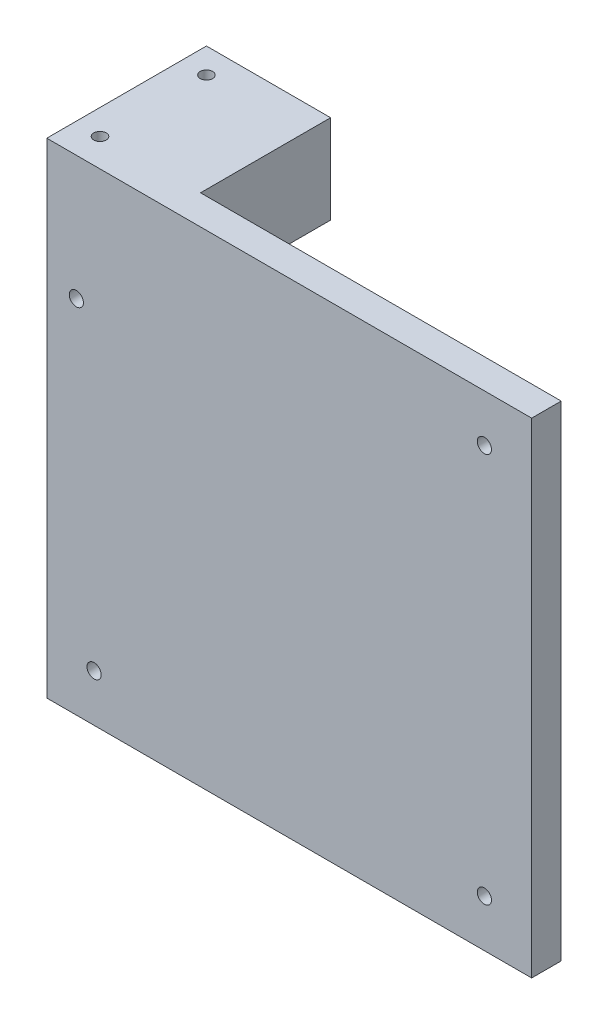
ISO-10303-21;
HEADER;
FILE_DESCRIPTION(('STEP AP214'),'2;1');
FILE_NAME('part.step','',(''),(''),'','','');
FILE_SCHEMA(('AUTOMOTIVE_DESIGN { 1 0 10303 214 1 1 1 1 }'));
ENDSEC;
DATA;
#1=APPLICATION_CONTEXT('core data for automotive mechanical design processes');
#2=APPLICATION_PROTOCOL_DEFINITION('international standard','automotive_design',2000,#1);
#3=PRODUCT_CONTEXT('',#1,'mechanical');
#4=PRODUCT('Part','Part','',(#3));
#5=PRODUCT_RELATED_PRODUCT_CATEGORY('part','',(#4));
#6=PRODUCT_DEFINITION_FORMATION('','',#4);
#7=PRODUCT_DEFINITION_CONTEXT('part definition',#1,'design');
#8=PRODUCT_DEFINITION('design','',#6,#7);
#9=PRODUCT_DEFINITION_SHAPE('','',#8);
#10=(LENGTH_UNIT() NAMED_UNIT(*) SI_UNIT(.MILLI.,.METRE.));
#11=(NAMED_UNIT(*) PLANE_ANGLE_UNIT() SI_UNIT($,.RADIAN.));
#12=(NAMED_UNIT(*) SI_UNIT($,.STERADIAN.) SOLID_ANGLE_UNIT());
#13=UNCERTAINTY_MEASURE_WITH_UNIT(LENGTH_MEASURE(1.E-05),#10,'distance_accuracy_value','');
#14=(GEOMETRIC_REPRESENTATION_CONTEXT(3) GLOBAL_UNCERTAINTY_ASSIGNED_CONTEXT((#13)) GLOBAL_UNIT_ASSIGNED_CONTEXT((#10,
#11,#12)) REPRESENTATION_CONTEXT('',''));
#15=CARTESIAN_POINT('',(0.,0.,0.));
#16=DIRECTION('',(0.,0.,1.));
#17=DIRECTION('',(1.,0.,0.));
#18=AXIS2_PLACEMENT_3D('',#15,#16,#17);
#19=CARTESIAN_POINT('',(-41.,-41.,245.));
#20=DIRECTION('',(1.,0.,0.));
#21=DIRECTION('',(0.,0.,-1.));
#22=AXIS2_PLACEMENT_3D('',#19,#20,#21);
#23=PLANE('',#22);
#24=DIRECTION('',(0.,0.,-1.));
#25=VECTOR('',#24,1.);
#26=CARTESIAN_POINT('',(-41.,26.,-27.));
#27=LINE('',#26,#25);
#28=CARTESIAN_POINT('',(-41.,26.,-5.));
#29=VERTEX_POINT('',#28);
#30=CARTESIAN_POINT('',(-41.,26.,-27.));
#31=VERTEX_POINT('',#30);
#32=EDGE_CURVE('E103',#29,#31,#27,.T.);
#33=ORIENTED_EDGE('',*,*,#32,.F.);
#34=DIRECTION('',(0.,1.,0.));
#35=VECTOR('',#34,1.);
#36=CARTESIAN_POINT('',(-41.,-41.,-5.));
#37=LINE('',#36,#35);
#38=CARTESIAN_POINT('',(-41.,-41.,-5.));
#39=VERTEX_POINT('',#38);
#40=EDGE_CURVE('E328',#39,#29,#37,.T.);
#41=ORIENTED_EDGE('',*,*,#40,.F.);
#42=DIRECTION('',(0.,0.,-1.));
#43=VECTOR('',#42,1.);
#44=CARTESIAN_POINT('',(-41.,-41.,245.));
#45=LINE('',#44,#43);
#46=CARTESIAN_POINT('',(-41.,-41.,0.));
#47=VERTEX_POINT('',#46);
#48=EDGE_CURVE('E143',#47,#39,#45,.T.);
#49=ORIENTED_EDGE('',*,*,#48,.F.);
#50=DIRECTION('',(0.,-1.,0.));
#51=VECTOR('',#50,1.);
#52=CARTESIAN_POINT('',(-41.,10.,0.));
#53=LINE('',#52,#51);
#54=CARTESIAN_POINT('',(-41.,41.,0.));
#55=VERTEX_POINT('',#54);
#56=EDGE_CURVE('E124',#55,#47,#53,.T.);
#57=ORIENTED_EDGE('',*,*,#56,.F.);
#58=DIRECTION('',(0.,0.,-1.));
#59=VECTOR('',#58,1.);
#60=CARTESIAN_POINT('',(-41.,41.,245.));
#61=LINE('',#60,#59);
#62=CARTESIAN_POINT('',(-41.,41.,-27.));
#63=VERTEX_POINT('',#62);
#64=EDGE_CURVE('E120',#55,#63,#61,.T.);
#65=ORIENTED_EDGE('',*,*,#64,.T.);
#66=DIRECTION('',(0.,1.,0.));
#67=VECTOR('',#66,1.);
#68=CARTESIAN_POINT('',(-41.,41.,-27.));
#69=LINE('',#68,#67);
#70=EDGE_CURVE('E56',#31,#63,#69,.T.);
#71=ORIENTED_EDGE('',*,*,#70,.F.);
#72=EDGE_LOOP('',(#33,#41,#49,#57,#65,#71));
#73=FACE_BOUND('',#72,.T.);
#74=ADVANCED_FACE('F39',(#73),#23,.F.);
#75=CARTESIAN_POINT('',(-41.,-41.,245.));
#76=DIRECTION('',(0.,1.,0.));
#77=DIRECTION('',(0.,0.,1.));
#78=AXIS2_PLACEMENT_3D('',#75,#76,#77);
#79=PLANE('',#78);
#80=ORIENTED_EDGE('',*,*,#48,.T.);
#81=DIRECTION('',(-1.,0.,0.));
#82=VECTOR('',#81,1.);
#83=CARTESIAN_POINT('',(-41.,-41.,-5.));
#84=LINE('',#83,#82);
#85=CARTESIAN_POINT('',(41.,-41.,-5.));
#86=VERTEX_POINT('',#85);
#87=EDGE_CURVE('E316',#86,#39,#84,.T.);
#88=ORIENTED_EDGE('',*,*,#87,.F.);
#89=DIRECTION('',(0.,0.,-1.));
#90=VECTOR('',#89,1.);
#91=CARTESIAN_POINT('',(41.,-41.,245.));
#92=LINE('',#91,#90);
#93=CARTESIAN_POINT('',(41.,-41.,0.));
#94=VERTEX_POINT('',#93);
#95=EDGE_CURVE('E139',#94,#86,#92,.T.);
#96=ORIENTED_EDGE('',*,*,#95,.F.);
#97=DIRECTION('',(-1.,0.,0.));
#98=VECTOR('',#97,1.);
#99=CARTESIAN_POINT('',(41.001,-41.,0.));
#100=LINE('',#99,#98);
#101=EDGE_CURVE('E290',#94,#47,#100,.T.);
#102=ORIENTED_EDGE('',*,*,#101,.T.);
#103=EDGE_LOOP('',(#80,#88,#96,#102));
#104=FACE_BOUND('',#103,.T.);
#105=ADVANCED_FACE('F220',(#104),#79,.F.);
#106=CARTESIAN_POINT('',(41.,-41.,245.));
#107=DIRECTION('',(-1.,0.,0.));
#108=DIRECTION('',(0.,0.,1.));
#109=AXIS2_PLACEMENT_3D('',#106,#107,#108);
#110=PLANE('',#109);
#111=ORIENTED_EDGE('',*,*,#95,.T.);
#112=DIRECTION('',(0.,-1.,0.));
#113=VECTOR('',#112,1.);
#114=CARTESIAN_POINT('',(41.,-41.,-5.));
#115=LINE('',#114,#113);
#116=CARTESIAN_POINT('',(41.,41.,-5.));
#117=VERTEX_POINT('',#116);
#118=EDGE_CURVE('E319',#117,#86,#115,.T.);
#119=ORIENTED_EDGE('',*,*,#118,.F.);
#120=DIRECTION('',(0.,0.,-1.));
#121=VECTOR('',#120,1.);
#122=CARTESIAN_POINT('',(41.,41.,245.));
#123=LINE('',#122,#121);
#124=CARTESIAN_POINT('',(41.,41.,0.));
#125=VERTEX_POINT('',#124);
#126=EDGE_CURVE('E135',#125,#117,#123,.T.);
#127=ORIENTED_EDGE('',*,*,#126,.F.);
#128=DIRECTION('',(0.,1.,0.));
#129=VECTOR('',#128,1.);
#130=CARTESIAN_POINT('',(41.,-41.,0.));
#131=LINE('',#130,#129);
#132=EDGE_CURVE('E64',#94,#125,#131,.T.);
#133=ORIENTED_EDGE('',*,*,#132,.F.);
#134=EDGE_LOOP('',(#111,#119,#127,#133));
#135=FACE_BOUND('',#134,.T.);
#136=ADVANCED_FACE('F224',(#135),#110,.F.);
#137=CARTESIAN_POINT('',(0.,0.,-27.));
#138=DIRECTION('',(0.,0.,-1.));
#139=DIRECTION('',(-1.,0.,0.));
#140=AXIS2_PLACEMENT_3D('',#137,#138,#139);
#141=PLANE('',#140);
#142=DIRECTION('',(1.,0.,0.));
#143=VECTOR('',#142,1.);
#144=CARTESIAN_POINT('',(-41.,26.,-27.));
#145=LINE('',#144,#143);
#146=CARTESIAN_POINT('',(-20.,26.,-27.));
#147=VERTEX_POINT('',#146);
#148=EDGE_CURVE('E105',#31,#147,#145,.T.);
#149=ORIENTED_EDGE('',*,*,#148,.F.);
#150=ORIENTED_EDGE('',*,*,#70,.T.);
#151=DIRECTION('',(1.,0.,0.));
#152=VECTOR('',#151,1.);
#153=CARTESIAN_POINT('',(41.,41.,-27.));
#154=LINE('',#153,#152);
#155=CARTESIAN_POINT('',(-20.,41.,-27.));
#156=VERTEX_POINT('',#155);
#157=EDGE_CURVE('E123',#63,#156,#154,.T.);
#158=ORIENTED_EDGE('',*,*,#157,.T.);
#159=DIRECTION('',(0.,1.,0.));
#160=VECTOR('',#159,1.);
#161=CARTESIAN_POINT('',(-20.,24.,-27.));
#162=LINE('',#161,#160);
#163=EDGE_CURVE('E115',#147,#156,#162,.T.);
#164=ORIENTED_EDGE('',*,*,#163,.F.);
#165=EDGE_LOOP('',(#149,#150,#158,#164));
#166=FACE_BOUND('',#165,.T.);
#167=ADVANCED_FACE('F114',(#166),#141,.T.);
#168=CARTESIAN_POINT('',(-41.,41.,245.));
#169=DIRECTION('',(0.,-1.,0.));
#170=DIRECTION('',(0.,0.,-1.));
#171=AXIS2_PLACEMENT_3D('',#168,#169,#170);
#172=PLANE('',#171);
#173=CARTESIAN_POINT('',(-36.75,41.,-22.75));
#174=DIRECTION('',(0.,1.,0.));
#175=DIRECTION('',(0.,0.,1.));
#176=AXIS2_PLACEMENT_3D('',#173,#174,#175);
#177=CIRCLE('',#176,1.05);
#178=CARTESIAN_POINT('',(-36.75,41.,-21.7));
#179=VERTEX_POINT('',#178);
#180=EDGE_CURVE('E253',#179,#179,#177,.T.);
#181=ORIENTED_EDGE('',*,*,#180,.F.);
#182=EDGE_LOOP('',(#181));
#183=FACE_BOUND('',#182,.T.);
#184=CARTESIAN_POINT('',(-36.75,41.,-4.74999999999999));
#185=DIRECTION('',(0.,1.,0.));
#186=DIRECTION('',(0.,0.,1.));
#187=AXIS2_PLACEMENT_3D('',#184,#185,#186);
#188=CIRCLE('',#187,1.05);
#189=CARTESIAN_POINT('',(-36.75,41.,-3.69999999999999));
#190=VERTEX_POINT('',#189);
#191=EDGE_CURVE('E254',#190,#190,#188,.T.);
#192=ORIENTED_EDGE('',*,*,#191,.F.);
#193=EDGE_LOOP('',(#192));
#194=FACE_BOUND('',#193,.T.);
#195=DIRECTION('',(1.,0.,0.));
#196=VECTOR('',#195,1.);
#197=CARTESIAN_POINT('',(-20.,41.,-5.));
#198=LINE('',#197,#196);
#199=CARTESIAN_POINT('',(-20.,41.,-5.));
#200=VERTEX_POINT('',#199);
#201=EDGE_CURVE('E322',#200,#117,#198,.T.);
#202=ORIENTED_EDGE('',*,*,#201,.F.);
#203=DIRECTION('',(0.,0.,1.));
#204=VECTOR('',#203,1.);
#205=CARTESIAN_POINT('',(-20.,41.,-7.));
#206=LINE('',#205,#204);
#207=EDGE_CURVE('E298',#156,#200,#206,.T.);
#208=ORIENTED_EDGE('',*,*,#207,.F.);
#209=ORIENTED_EDGE('',*,*,#157,.F.);
#210=ORIENTED_EDGE('',*,*,#64,.F.);
#211=DIRECTION('',(-1.,0.,0.));
#212=VECTOR('',#211,1.);
#213=CARTESIAN_POINT('',(41.001,41.,0.));
#214=LINE('',#213,#212);
#215=EDGE_CURVE('E289',#125,#55,#214,.T.);
#216=ORIENTED_EDGE('',*,*,#215,.F.);
#217=ORIENTED_EDGE('',*,*,#126,.T.);
#218=EDGE_LOOP('',(#202,#208,#209,#210,#216,#217));
#219=FACE_BOUND('',#218,.T.);
#220=ADVANCED_FACE('F232',(#183,#194,#219),#172,.F.);
#221=CARTESIAN_POINT('',(0.,0.,0.));
#222=DIRECTION('',(0.,0.,-1.));
#223=DIRECTION('',(-1.,0.,0.));
#224=AXIS2_PLACEMENT_3D('',#221,#222,#223);
#225=PLANE('',#224);
#226=ORIENTED_EDGE('',*,*,#56,.T.);
#227=ORIENTED_EDGE('',*,*,#101,.F.);
#228=ORIENTED_EDGE('',*,*,#132,.T.);
#229=ORIENTED_EDGE('',*,*,#215,.T.);
#230=EDGE_LOOP('',(#226,#227,#228,#229));
#231=FACE_BOUND('',#230,.T.);
#232=CARTESIAN_POINT('',(-36.,20.,0.));
#233=DIRECTION('',(0.,0.,-1.));
#234=DIRECTION('',(-1.,0.,0.));
#235=AXIS2_PLACEMENT_3D('',#232,#233,#234);
#236=CIRCLE('',#235,1.2);
#237=CARTESIAN_POINT('',(-37.2,20.,0.));
#238=VERTEX_POINT('',#237);
#239=EDGE_CURVE('E273',#238,#238,#236,.T.);
#240=ORIENTED_EDGE('',*,*,#239,.T.);
#241=EDGE_LOOP('',(#240));
#242=FACE_BOUND('',#241,.T.);
#243=CARTESIAN_POINT('',(-33.,-33.,0.));
#244=DIRECTION('',(0.,0.,-1.));
#245=DIRECTION('',(-1.,0.,0.));
#246=AXIS2_PLACEMENT_3D('',#243,#244,#245);
#247=CIRCLE('',#246,1.2);
#248=CARTESIAN_POINT('',(-34.2,-33.,0.));
#249=VERTEX_POINT('',#248);
#250=EDGE_CURVE('E277',#249,#249,#247,.T.);
#251=ORIENTED_EDGE('',*,*,#250,.T.);
#252=EDGE_LOOP('',(#251));
#253=FACE_BOUND('',#252,.T.);
#254=CARTESIAN_POINT('',(33.,-33.,0.));
#255=DIRECTION('',(0.,0.,-1.));
#256=DIRECTION('',(-1.,0.,0.));
#257=AXIS2_PLACEMENT_3D('',#254,#255,#256);
#258=CIRCLE('',#257,1.2);
#259=CARTESIAN_POINT('',(31.8,-33.,0.));
#260=VERTEX_POINT('',#259);
#261=EDGE_CURVE('E281',#260,#260,#258,.T.);
#262=ORIENTED_EDGE('',*,*,#261,.T.);
#263=EDGE_LOOP('',(#262));
#264=FACE_BOUND('',#263,.T.);
#265=CARTESIAN_POINT('',(33.,33.,0.));
#266=DIRECTION('',(0.,0.,-1.));
#267=DIRECTION('',(-1.,0.,0.));
#268=AXIS2_PLACEMENT_3D('',#265,#266,#267);
#269=CIRCLE('',#268,1.2);
#270=CARTESIAN_POINT('',(31.8,33.,0.));
#271=VERTEX_POINT('',#270);
#272=EDGE_CURVE('E285',#271,#271,#269,.T.);
#273=ORIENTED_EDGE('',*,*,#272,.T.);
#274=EDGE_LOOP('',(#273));
#275=FACE_BOUND('',#274,.T.);
#276=ADVANCED_FACE('F235',(#231,#242,#253,#264,#275),#225,.F.);
#277=CARTESIAN_POINT('',(-36.75,31.,-4.74999999999999));
#278=DIRECTION('',(0.,1.,0.));
#279=DIRECTION('',(0.,0.,1.));
#280=AXIS2_PLACEMENT_3D('',#277,#278,#279);
#281=CYLINDRICAL_SURFACE('',#280,1.05);
#282=CARTESIAN_POINT('',(-36.75,35.2,-4.74999999999999));
#283=DIRECTION('',(0.,1.,0.));
#284=DIRECTION('',(0.,0.,1.));
#285=AXIS2_PLACEMENT_3D('',#282,#283,#284);
#286=CIRCLE('',#285,1.05);
#287=CARTESIAN_POINT('',(-36.75,35.2,-3.69999999999999));
#288=VERTEX_POINT('',#287);
#289=EDGE_CURVE('E269',#288,#288,#286,.T.);
#290=ORIENTED_EDGE('',*,*,#289,.F.);
#291=EDGE_LOOP('',(#290));
#292=FACE_BOUND('',#291,.T.);
#293=ORIENTED_EDGE('',*,*,#191,.T.);
#294=EDGE_LOOP('',(#293));
#295=FACE_BOUND('',#294,.T.);
#296=ADVANCED_FACE('F170',(#292,#295),#281,.F.);
#297=CARTESIAN_POINT('',(-36.75,31.,-22.75));
#298=DIRECTION('',(0.,1.,0.));
#299=DIRECTION('',(0.,0.,1.));
#300=AXIS2_PLACEMENT_3D('',#297,#298,#299);
#301=CYLINDRICAL_SURFACE('',#300,1.05);
#302=CARTESIAN_POINT('',(-36.75,35.2,-22.75));
#303=DIRECTION('',(0.,1.,0.));
#304=DIRECTION('',(0.,0.,1.));
#305=AXIS2_PLACEMENT_3D('',#302,#303,#304);
#306=CIRCLE('',#305,1.05);
#307=CARTESIAN_POINT('',(-36.75,35.2,-21.7));
#308=VERTEX_POINT('',#307);
#309=EDGE_CURVE('E261',#308,#308,#306,.T.);
#310=ORIENTED_EDGE('',*,*,#309,.F.);
#311=EDGE_LOOP('',(#310));
#312=FACE_BOUND('',#311,.T.);
#313=ORIENTED_EDGE('',*,*,#180,.T.);
#314=EDGE_LOOP('',(#313));
#315=FACE_BOUND('',#314,.T.);
#316=ADVANCED_FACE('F159',(#312,#315),#301,.F.);
#317=CARTESIAN_POINT('',(-36.75,35.2,-22.75));
#318=DIRECTION('',(0.,1.,0.));
#319=DIRECTION('',(0.,0.,1.));
#320=AXIS2_PLACEMENT_3D('',#317,#318,#319);
#321=PLANE('',#320);
#322=ORIENTED_EDGE('',*,*,#309,.T.);
#323=EDGE_LOOP('',(#322));
#324=FACE_BOUND('',#323,.T.);
#325=ADVANCED_FACE('F169',(#324),#321,.T.);
#326=CARTESIAN_POINT('',(-36.75,35.2,-4.74999999999999));
#327=DIRECTION('',(0.,1.,0.));
#328=DIRECTION('',(0.,0.,1.));
#329=AXIS2_PLACEMENT_3D('',#326,#327,#328);
#330=PLANE('',#329);
#331=ORIENTED_EDGE('',*,*,#289,.T.);
#332=EDGE_LOOP('',(#331));
#333=FACE_BOUND('',#332,.T.);
#334=ADVANCED_FACE('F181',(#333),#330,.T.);
#335=CARTESIAN_POINT('',(-36.,20.,3.));
#336=DIRECTION('',(0.,0.,-1.));
#337=DIRECTION('',(-1.,0.,0.));
#338=AXIS2_PLACEMENT_3D('',#335,#336,#337);
#339=CYLINDRICAL_SURFACE('',#338,1.2);
#340=CARTESIAN_POINT('',(-36.,20.,-5.));
#341=DIRECTION('',(0.,0.,1.));
#342=DIRECTION('',(1.,0.,0.));
#343=AXIS2_PLACEMENT_3D('',#340,#341,#342);
#344=CIRCLE('',#343,1.2);
#345=CARTESIAN_POINT('',(-34.8,20.,-5.));
#346=VERTEX_POINT('',#345);
#347=EDGE_CURVE('E304',#346,#346,#344,.F.);
#348=ORIENTED_EDGE('',*,*,#347,.T.);
#349=EDGE_LOOP('',(#348));
#350=FACE_BOUND('',#349,.T.);
#351=ORIENTED_EDGE('',*,*,#239,.F.);
#352=EDGE_LOOP('',(#351));
#353=FACE_BOUND('',#352,.T.);
#354=ADVANCED_FACE('F191',(#350,#353),#339,.F.);
#355=CARTESIAN_POINT('',(-33.,-33.,3.));
#356=DIRECTION('',(0.,0.,-1.));
#357=DIRECTION('',(-1.,0.,0.));
#358=AXIS2_PLACEMENT_3D('',#355,#356,#357);
#359=CYLINDRICAL_SURFACE('',#358,1.2);
#360=CARTESIAN_POINT('',(-33.,-33.,-5.));
#361=DIRECTION('',(0.,0.,1.));
#362=DIRECTION('',(1.,0.,0.));
#363=AXIS2_PLACEMENT_3D('',#360,#361,#362);
#364=CIRCLE('',#363,1.2);
#365=CARTESIAN_POINT('',(-31.8,-33.,-5.));
#366=VERTEX_POINT('',#365);
#367=EDGE_CURVE('E308',#366,#366,#364,.F.);
#368=ORIENTED_EDGE('',*,*,#367,.T.);
#369=EDGE_LOOP('',(#368));
#370=FACE_BOUND('',#369,.T.);
#371=ORIENTED_EDGE('',*,*,#250,.F.);
#372=EDGE_LOOP('',(#371));
#373=FACE_BOUND('',#372,.T.);
#374=ADVANCED_FACE('F195',(#370,#373),#359,.F.);
#375=CARTESIAN_POINT('',(33.,-33.,3.));
#376=DIRECTION('',(0.,0.,-1.));
#377=DIRECTION('',(-1.,0.,0.));
#378=AXIS2_PLACEMENT_3D('',#375,#376,#377);
#379=CYLINDRICAL_SURFACE('',#378,1.2);
#380=CARTESIAN_POINT('',(33.,-33.,-5.));
#381=DIRECTION('',(0.,0.,1.));
#382=DIRECTION('',(1.,0.,0.));
#383=AXIS2_PLACEMENT_3D('',#380,#381,#382);
#384=CIRCLE('',#383,1.2);
#385=CARTESIAN_POINT('',(34.2,-33.,-5.));
#386=VERTEX_POINT('',#385);
#387=EDGE_CURVE('E312',#386,#386,#384,.F.);
#388=ORIENTED_EDGE('',*,*,#387,.T.);
#389=EDGE_LOOP('',(#388));
#390=FACE_BOUND('',#389,.T.);
#391=ORIENTED_EDGE('',*,*,#261,.F.);
#392=EDGE_LOOP('',(#391));
#393=FACE_BOUND('',#392,.T.);
#394=ADVANCED_FACE('F199',(#390,#393),#379,.F.);
#395=CARTESIAN_POINT('',(33.,33.,3.));
#396=DIRECTION('',(0.,0.,-1.));
#397=DIRECTION('',(-1.,0.,0.));
#398=AXIS2_PLACEMENT_3D('',#395,#396,#397);
#399=CYLINDRICAL_SURFACE('',#398,1.2);
#400=CARTESIAN_POINT('',(33.,33.,-5.));
#401=DIRECTION('',(0.,0.,1.));
#402=DIRECTION('',(1.,0.,0.));
#403=AXIS2_PLACEMENT_3D('',#400,#401,#402);
#404=CIRCLE('',#403,1.2);
#405=CARTESIAN_POINT('',(34.2,33.,-5.));
#406=VERTEX_POINT('',#405);
#407=EDGE_CURVE('E42',#406,#406,#404,.F.);
#408=ORIENTED_EDGE('',*,*,#407,.T.);
#409=EDGE_LOOP('',(#408));
#410=FACE_BOUND('',#409,.T.);
#411=ORIENTED_EDGE('',*,*,#272,.F.);
#412=EDGE_LOOP('',(#411));
#413=FACE_BOUND('',#412,.T.);
#414=ADVANCED_FACE('F203',(#410,#413),#399,.F.);
#415=CARTESIAN_POINT('',(-20.,0.,0.));
#416=DIRECTION('',(-1.,0.,0.));
#417=DIRECTION('',(0.,0.,1.));
#418=AXIS2_PLACEMENT_3D('',#415,#416,#417);
#419=PLANE('',#418);
#420=DIRECTION('',(0.,1.,0.));
#421=VECTOR('',#420,1.);
#422=CARTESIAN_POINT('',(-20.,41.,-5.));
#423=LINE('',#422,#421);
#424=CARTESIAN_POINT('',(-20.,26.,-5.));
#425=VERTEX_POINT('',#424);
#426=EDGE_CURVE('E325',#425,#200,#423,.T.);
#427=ORIENTED_EDGE('',*,*,#426,.F.);
#428=DIRECTION('',(0.,0.,1.));
#429=VECTOR('',#428,1.);
#430=CARTESIAN_POINT('',(-20.,26.,-27.));
#431=LINE('',#430,#429);
#432=EDGE_CURVE('E117',#147,#425,#431,.T.);
#433=ORIENTED_EDGE('',*,*,#432,.F.);
#434=ORIENTED_EDGE('',*,*,#163,.T.);
#435=ORIENTED_EDGE('',*,*,#207,.T.);
#436=EDGE_LOOP('',(#427,#433,#434,#435));
#437=FACE_BOUND('',#436,.T.);
#438=ADVANCED_FACE('F207',(#437),#419,.F.);
#439=CARTESIAN_POINT('',(0.,0.,-5.));
#440=DIRECTION('',(0.,0.,1.));
#441=DIRECTION('',(1.,0.,0.));
#442=AXIS2_PLACEMENT_3D('',#439,#440,#441);
#443=PLANE('',#442);
#444=DIRECTION('',(-1.,0.,0.));
#445=VECTOR('',#444,1.);
#446=CARTESIAN_POINT('',(-41.,26.,-5.));
#447=LINE('',#446,#445);
#448=EDGE_CURVE('E108',#425,#29,#447,.T.);
#449=ORIENTED_EDGE('',*,*,#448,.F.);
#450=ORIENTED_EDGE('',*,*,#426,.T.);
#451=ORIENTED_EDGE('',*,*,#201,.T.);
#452=ORIENTED_EDGE('',*,*,#118,.T.);
#453=ORIENTED_EDGE('',*,*,#87,.T.);
#454=ORIENTED_EDGE('',*,*,#40,.T.);
#455=EDGE_LOOP('',(#449,#450,#451,#452,#453,#454));
#456=FACE_BOUND('',#455,.T.);
#457=ORIENTED_EDGE('',*,*,#367,.F.);
#458=EDGE_LOOP('',(#457));
#459=FACE_BOUND('',#458,.T.);
#460=ORIENTED_EDGE('',*,*,#407,.F.);
#461=EDGE_LOOP('',(#460));
#462=FACE_BOUND('',#461,.T.);
#463=ORIENTED_EDGE('',*,*,#387,.F.);
#464=EDGE_LOOP('',(#463));
#465=FACE_BOUND('',#464,.T.);
#466=ORIENTED_EDGE('',*,*,#347,.F.);
#467=EDGE_LOOP('',(#466));
#468=FACE_BOUND('',#467,.T.);
#469=ADVANCED_FACE('F211',(#456,#459,#462,#465,#468),#443,.F.);
#470=CARTESIAN_POINT('',(0.,26.,0.));
#471=DIRECTION('',(0.,1.,0.));
#472=DIRECTION('',(0.,0.,1.));
#473=AXIS2_PLACEMENT_3D('',#470,#471,#472);
#474=PLANE('',#473);
#475=ORIENTED_EDGE('',*,*,#32,.T.);
#476=ORIENTED_EDGE('',*,*,#148,.T.);
#477=ORIENTED_EDGE('',*,*,#432,.T.);
#478=ORIENTED_EDGE('',*,*,#448,.T.);
#479=EDGE_LOOP('',(#475,#476,#477,#478));
#480=FACE_BOUND('',#479,.T.);
#481=ADVANCED_FACE('F104',(#480),#474,.F.);
#482=CLOSED_SHELL('',(#74,#105,#136,#167,#220,#276,#296,#316,#325,#334,#354,#374,#394,#414,#438,
#469,#481));
#483=CARTESIAN_POINT('',(-36.75,35.,-4.74999999999999));
#484=DIRECTION('',(0.,1.,0.));
#485=DIRECTION('',(0.,0.,1.));
#486=AXIS2_PLACEMENT_3D('',#483,#484,#485);
#487=PLANE('',#486);
#488=CARTESIAN_POINT('',(-36.75,35.,-4.74999999999999));
#489=DIRECTION('',(0.,1.,0.));
#490=DIRECTION('',(0.,0.,1.));
#491=AXIS2_PLACEMENT_3D('',#488,#489,#490);
#492=CIRCLE('',#491,1.05);
#493=CARTESIAN_POINT('',(-36.75,35.,-3.69999999999999));
#494=VERTEX_POINT('',#493);
#495=EDGE_CURVE('E11',#494,#494,#492,.F.);
#496=ORIENTED_EDGE('',*,*,#495,.T.);
#497=EDGE_LOOP('',(#496));
#498=FACE_BOUND('',#497,.T.);
#499=ADVANCED_FACE('F183',(#498),#487,.F.);
#500=CARTESIAN_POINT('',(-36.75,31.,-4.74999999999999));
#501=DIRECTION('',(0.,1.,0.));
#502=DIRECTION('',(0.,0.,1.));
#503=AXIS2_PLACEMENT_3D('',#500,#501,#502);
#504=PLANE('',#503);
#505=CARTESIAN_POINT('',(-36.75,31.,-4.74999999999999));
#506=DIRECTION('',(0.,1.,0.));
#507=DIRECTION('',(0.,0.,1.));
#508=AXIS2_PLACEMENT_3D('',#505,#506,#507);
#509=CIRCLE('',#508,1.05);
#510=CARTESIAN_POINT('',(-36.75,31.,-3.69999999999999));
#511=VERTEX_POINT('',#510);
#512=EDGE_CURVE('E251',#511,#511,#509,.T.);
#513=ORIENTED_EDGE('',*,*,#512,.T.);
#514=EDGE_LOOP('',(#513));
#515=FACE_BOUND('',#514,.T.);
#516=ADVANCED_FACE('F186',(#515),#504,.T.);
#517=ORIENTED_EDGE('',*,*,#512,.F.);
#518=EDGE_LOOP('',(#517));
#519=FACE_BOUND('',#518,.T.);
#520=ORIENTED_EDGE('',*,*,#495,.F.);
#521=EDGE_LOOP('',(#520));
#522=FACE_BOUND('',#521,.T.);
#523=ADVANCED_FACE('F243',(#519,#522),#281,.F.);
#524=CLOSED_SHELL('',(#499,#516,#523));
#525=CARTESIAN_POINT('',(-36.75,35.,-22.75));
#526=DIRECTION('',(0.,1.,0.));
#527=DIRECTION('',(0.,0.,1.));
#528=AXIS2_PLACEMENT_3D('',#525,#526,#527);
#529=PLANE('',#528);
#530=CARTESIAN_POINT('',(-36.75,35.,-22.75));
#531=DIRECTION('',(0.,1.,0.));
#532=DIRECTION('',(0.,0.,1.));
#533=AXIS2_PLACEMENT_3D('',#530,#531,#532);
#534=CIRCLE('',#533,1.05);
#535=CARTESIAN_POINT('',(-36.75,35.,-21.7));
#536=VERTEX_POINT('',#535);
#537=EDGE_CURVE('E49',#536,#536,#534,.F.);
#538=ORIENTED_EDGE('',*,*,#537,.T.);
#539=EDGE_LOOP('',(#538));
#540=FACE_BOUND('',#539,.T.);
#541=ADVANCED_FACE('F151',(#540),#529,.F.);
#542=CARTESIAN_POINT('',(-36.75,31.,-22.75));
#543=DIRECTION('',(0.,1.,0.));
#544=DIRECTION('',(0.,0.,1.));
#545=AXIS2_PLACEMENT_3D('',#542,#543,#544);
#546=PLANE('',#545);
#547=CARTESIAN_POINT('',(-36.75,31.,-22.75));
#548=DIRECTION('',(0.,1.,0.));
#549=DIRECTION('',(0.,0.,1.));
#550=AXIS2_PLACEMENT_3D('',#547,#548,#549);
#551=CIRCLE('',#550,1.05);
#552=CARTESIAN_POINT('',(-36.75,31.,-21.7));
#553=VERTEX_POINT('',#552);
#554=EDGE_CURVE('E129',#553,#553,#551,.T.);
#555=ORIENTED_EDGE('',*,*,#554,.T.);
#556=EDGE_LOOP('',(#555));
#557=FACE_BOUND('',#556,.T.);
#558=ADVANCED_FACE('F155',(#557),#546,.T.);
#559=ORIENTED_EDGE('',*,*,#554,.F.);
#560=EDGE_LOOP('',(#559));
#561=FACE_BOUND('',#560,.T.);
#562=ORIENTED_EDGE('',*,*,#537,.F.);
#563=EDGE_LOOP('',(#562));
#564=FACE_BOUND('',#563,.T.);
#565=ADVANCED_FACE('F153',(#561,#564),#301,.F.);
#566=CLOSED_SHELL('',(#541,#558,#565));
#567=ORIENTED_CLOSED_SHELL('',*,#524,.T.);
#568=ORIENTED_CLOSED_SHELL('',*,#566,.T.);
#569=BREP_WITH_VOIDS('B2',#482,(#567,#568));
#570=ADVANCED_BREP_SHAPE_REPRESENTATION('',(#18,#569),#14);
#571=SHAPE_DEFINITION_REPRESENTATION(#9,#570);
ENDSEC;
END-ISO-10303-21;
